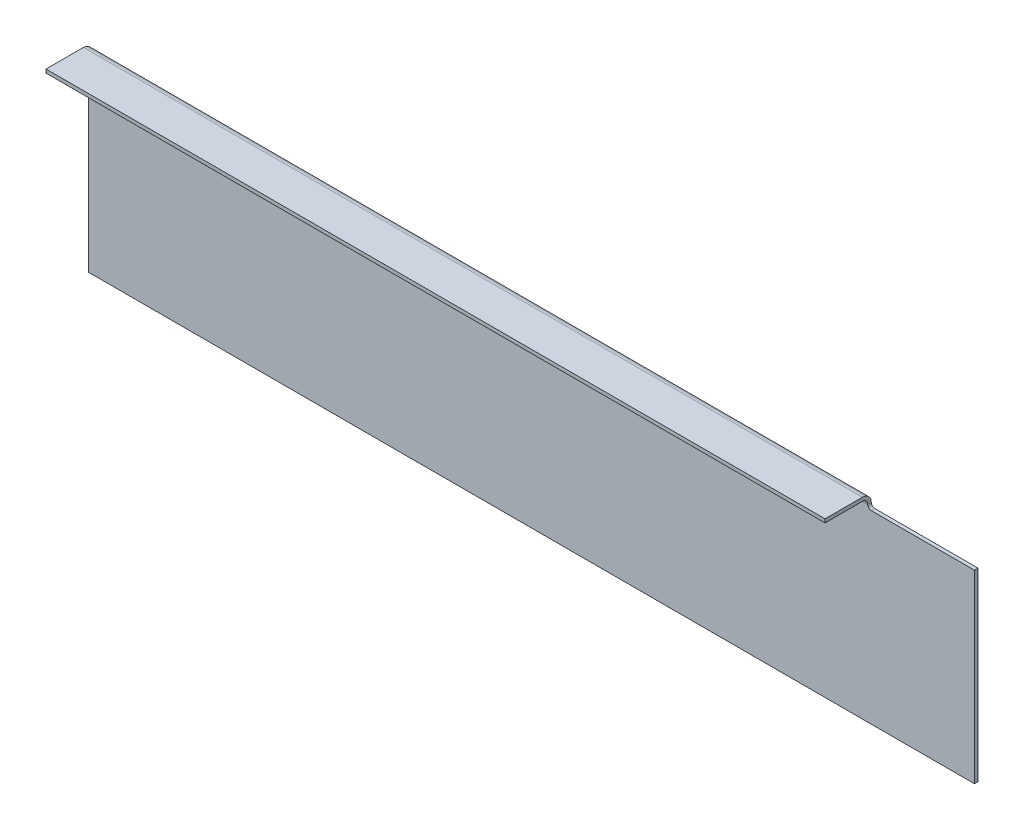
ISO-10303-21;
HEADER;
FILE_DESCRIPTION(('STEP AP214'),'2;1');
FILE_NAME('part.step','',(''),(''),'','','');
FILE_SCHEMA(('AUTOMOTIVE_DESIGN { 1 0 10303 214 1 1 1 1 }'));
ENDSEC;
DATA;
#1=APPLICATION_CONTEXT('core data for automotive mechanical design processes');
#2=APPLICATION_PROTOCOL_DEFINITION('international standard','automotive_design',2000,#1);
#3=PRODUCT_CONTEXT('',#1,'mechanical');
#4=PRODUCT('Part','Part','',(#3));
#5=PRODUCT_RELATED_PRODUCT_CATEGORY('part','',(#4));
#6=PRODUCT_DEFINITION_FORMATION('','',#4);
#7=PRODUCT_DEFINITION_CONTEXT('part definition',#1,'design');
#8=PRODUCT_DEFINITION('design','',#6,#7);
#9=PRODUCT_DEFINITION_SHAPE('','',#8);
#10=(LENGTH_UNIT() NAMED_UNIT(*) SI_UNIT(.MILLI.,.METRE.));
#11=(NAMED_UNIT(*) PLANE_ANGLE_UNIT() SI_UNIT($,.RADIAN.));
#12=(NAMED_UNIT(*) SI_UNIT($,.STERADIAN.) SOLID_ANGLE_UNIT());
#13=UNCERTAINTY_MEASURE_WITH_UNIT(LENGTH_MEASURE(1.E-05),#10,'distance_accuracy_value','');
#14=(GEOMETRIC_REPRESENTATION_CONTEXT(3) GLOBAL_UNCERTAINTY_ASSIGNED_CONTEXT((#13)) GLOBAL_UNIT_ASSIGNED_CONTEXT((#10,
#11,#12)) REPRESENTATION_CONTEXT('',''));
#15=CARTESIAN_POINT('',(0.,0.,0.));
#16=DIRECTION('',(0.,0.,1.));
#17=DIRECTION('',(1.,0.,0.));
#18=AXIS2_PLACEMENT_3D('',#15,#16,#17);
#19=CARTESIAN_POINT('',(78.999999999954,59.999999999954,-144.));
#20=DIRECTION('',(0.,0.,1.));
#21=DIRECTION('',(4.591527158693E-11,-1.,0.));
#22=AXIS2_PLACEMENT_3D('',#19,#20,#21);
#23=CYLINDRICAL_SURFACE('',#22,0.999999999954);
#24=DIRECTION('',(0.,0.,-1.));
#25=VECTOR('',#24,1.);
#26=CARTESIAN_POINT('',(79.,59.,-144.));
#27=LINE('',#26,#25);
#28=CARTESIAN_POINT('',(79.,59.,-144.));
#29=VERTEX_POINT('',#28);
#30=CARTESIAN_POINT('',(79.,59.,-145.));
#31=VERTEX_POINT('',#30);
#32=EDGE_CURVE('E26',#29,#31,#27,.T.);
#33=ORIENTED_EDGE('',*,*,#32,.T.);
#34=CARTESIAN_POINT('',(78.999999999954,59.999999999954,-145.));
#35=DIRECTION('',(0.,0.,-1.));
#36=DIRECTION('',(4.591527158693E-11,-1.,0.));
#37=AXIS2_PLACEMENT_3D('',#34,#35,#36);
#38=CIRCLE('',#37,0.999999999954);
#39=CARTESIAN_POINT('',(78.,60.,-145.));
#40=VERTEX_POINT('',#39);
#41=EDGE_CURVE('E11',#31,#40,#38,.T.);
#42=ORIENTED_EDGE('',*,*,#41,.T.);
#43=DIRECTION('',(0.,0.,-1.));
#44=VECTOR('',#43,1.);
#45=CARTESIAN_POINT('',(78.,60.,-144.));
#46=LINE('',#45,#44);
#47=CARTESIAN_POINT('',(78.,60.,-144.));
#48=VERTEX_POINT('',#47);
#49=EDGE_CURVE('E217',#48,#40,#46,.T.);
#50=ORIENTED_EDGE('',*,*,#49,.F.);
#51=CARTESIAN_POINT('',(78.999999999954,59.999999999954,-144.));
#52=DIRECTION('',(0.,0.,-1.));
#53=DIRECTION('',(4.591527158693E-11,-1.,0.));
#54=AXIS2_PLACEMENT_3D('',#51,#52,#53);
#55=CIRCLE('',#54,0.999999999954);
#56=EDGE_CURVE('E191',#29,#48,#55,.T.);
#57=ORIENTED_EDGE('',*,*,#56,.F.);
#58=EDGE_LOOP('',(#33,#42,#50,#57));
#59=FACE_BOUND('',#58,.T.);
#60=ADVANCED_FACE('F17',(#59),#23,.F.);
#61=CARTESIAN_POINT('',(108.,59.,-144.));
#62=DIRECTION('',(0.,1.,0.));
#63=DIRECTION('',(1.,0.,0.));
#64=AXIS2_PLACEMENT_3D('',#61,#62,#63);
#65=PLANE('',#64);
#66=DIRECTION('',(0.,0.,-1.));
#67=VECTOR('',#66,1.);
#68=CARTESIAN_POINT('',(108.,59.,-144.));
#69=LINE('',#68,#67);
#70=CARTESIAN_POINT('',(108.,59.,-144.));
#71=VERTEX_POINT('',#70);
#72=CARTESIAN_POINT('',(108.,59.,-145.));
#73=VERTEX_POINT('',#72);
#74=EDGE_CURVE('E222',#71,#73,#69,.T.);
#75=ORIENTED_EDGE('',*,*,#74,.T.);
#76=DIRECTION('',(-1.,0.,0.));
#77=VECTOR('',#76,1.);
#78=CARTESIAN_POINT('',(108.,59.,-145.));
#79=LINE('',#78,#77);
#80=EDGE_CURVE('E43',#73,#31,#79,.T.);
#81=ORIENTED_EDGE('',*,*,#80,.T.);
#82=ORIENTED_EDGE('',*,*,#32,.F.);
#83=DIRECTION('',(-1.,0.,0.));
#84=VECTOR('',#83,1.);
#85=CARTESIAN_POINT('',(108.,59.,-144.));
#86=LINE('',#85,#84);
#87=EDGE_CURVE('E187',#71,#29,#86,.T.);
#88=ORIENTED_EDGE('',*,*,#87,.F.);
#89=EDGE_LOOP('',(#75,#81,#82,#88));
#90=FACE_BOUND('',#89,.T.);
#91=ADVANCED_FACE('F241',(#90),#65,.T.);
#92=CARTESIAN_POINT('',(108.,7.,-144.));
#93=DIRECTION('',(1.,0.,0.));
#94=DIRECTION('',(0.,1.,0.));
#95=AXIS2_PLACEMENT_3D('',#92,#93,#94);
#96=PLANE('',#95);
#97=DIRECTION('',(0.,0.,-1.));
#98=VECTOR('',#97,1.);
#99=CARTESIAN_POINT('',(108.,7.,-144.));
#100=LINE('',#99,#98);
#101=CARTESIAN_POINT('',(108.,7.,-144.));
#102=VERTEX_POINT('',#101);
#103=CARTESIAN_POINT('',(108.,7.,-145.));
#104=VERTEX_POINT('',#103);
#105=EDGE_CURVE('E147',#102,#104,#100,.T.);
#106=ORIENTED_EDGE('',*,*,#105,.T.);
#107=DIRECTION('',(0.,1.,0.));
#108=VECTOR('',#107,1.);
#109=CARTESIAN_POINT('',(108.,7.,-145.));
#110=LINE('',#109,#108);
#111=EDGE_CURVE('E218',#104,#73,#110,.T.);
#112=ORIENTED_EDGE('',*,*,#111,.T.);
#113=ORIENTED_EDGE('',*,*,#74,.F.);
#114=DIRECTION('',(0.,1.,0.));
#115=VECTOR('',#114,1.);
#116=CARTESIAN_POINT('',(108.,7.,-144.));
#117=LINE('',#116,#115);
#118=EDGE_CURVE('E184',#102,#71,#117,.T.);
#119=ORIENTED_EDGE('',*,*,#118,.F.);
#120=EDGE_LOOP('',(#106,#112,#113,#119));
#121=FACE_BOUND('',#120,.T.);
#122=ADVANCED_FACE('F19',(#121),#96,.T.);
#123=CARTESIAN_POINT('',(-141.,60.,-142.5));
#124=DIRECTION('',(-1.,0.,0.));
#125=DIRECTION('',(0.,1.,0.));
#126=AXIS2_PLACEMENT_3D('',#123,#124,#125);
#127=CYLINDRICAL_SURFACE('',#126,2.5);
#128=DIRECTION('',(1.,0.,0.));
#129=VECTOR('',#128,1.);
#130=CARTESIAN_POINT('',(-141.,62.5,-142.5));
#131=LINE('',#130,#129);
#132=CARTESIAN_POINT('',(-141.,62.5,-142.5));
#133=VERTEX_POINT('',#132);
#134=CARTESIAN_POINT('',(78.,62.5,-142.5));
#135=VERTEX_POINT('',#134);
#136=EDGE_CURVE('E223',#133,#135,#131,.T.);
#137=ORIENTED_EDGE('',*,*,#136,.T.);
#138=CARTESIAN_POINT('',(78.,60.,-142.5));
#139=DIRECTION('',(-1.,0.,0.));
#140=DIRECTION('',(0.,1.,0.));
#141=AXIS2_PLACEMENT_3D('',#138,#139,#140);
#142=CIRCLE('',#141,2.5);
#143=EDGE_CURVE('E205',#135,#40,#142,.T.);
#144=ORIENTED_EDGE('',*,*,#143,.T.);
#145=DIRECTION('',(1.,0.,0.));
#146=VECTOR('',#145,1.);
#147=CARTESIAN_POINT('',(-141.,60.,-145.));
#148=LINE('',#147,#146);
#149=CARTESIAN_POINT('',(-141.,60.,-145.));
#150=VERTEX_POINT('',#149);
#151=EDGE_CURVE('E194',#150,#40,#148,.T.);
#152=ORIENTED_EDGE('',*,*,#151,.F.);
#153=CARTESIAN_POINT('',(-141.,60.,-142.5));
#154=DIRECTION('',(-1.,0.,0.));
#155=DIRECTION('',(0.,1.,0.));
#156=AXIS2_PLACEMENT_3D('',#153,#154,#155);
#157=CIRCLE('',#156,2.5);
#158=EDGE_CURVE('E157',#133,#150,#157,.T.);
#159=ORIENTED_EDGE('',*,*,#158,.F.);
#160=EDGE_LOOP('',(#137,#144,#152,#159));
#161=FACE_BOUND('',#160,.T.);
#162=ADVANCED_FACE('F414',(#161),#127,.T.);
#163=CARTESIAN_POINT('',(-141.,62.5,-132.));
#164=DIRECTION('',(0.,1.,0.));
#165=DIRECTION('',(1.,0.,0.));
#166=AXIS2_PLACEMENT_3D('',#163,#164,#165);
#167=PLANE('',#166);
#168=DIRECTION('',(1.,0.,0.));
#169=VECTOR('',#168,1.);
#170=CARTESIAN_POINT('',(-141.,62.5,-132.));
#171=LINE('',#170,#169);
#172=CARTESIAN_POINT('',(-141.,62.5,-132.));
#173=VERTEX_POINT('',#172);
#174=CARTESIAN_POINT('',(78.,62.5,-132.));
#175=VERTEX_POINT('',#174);
#176=EDGE_CURVE('E227',#173,#175,#171,.T.);
#177=ORIENTED_EDGE('',*,*,#176,.T.);
#178=DIRECTION('',(0.,0.,-1.));
#179=VECTOR('',#178,1.);
#180=CARTESIAN_POINT('',(78.,62.5,-132.));
#181=LINE('',#180,#179);
#182=EDGE_CURVE('E209',#175,#135,#181,.T.);
#183=ORIENTED_EDGE('',*,*,#182,.T.);
#184=ORIENTED_EDGE('',*,*,#136,.F.);
#185=DIRECTION('',(0.,0.,-1.));
#186=VECTOR('',#185,1.);
#187=CARTESIAN_POINT('',(-141.,62.5,-132.));
#188=LINE('',#187,#186);
#189=EDGE_CURVE('E178',#173,#133,#188,.T.);
#190=ORIENTED_EDGE('',*,*,#189,.F.);
#191=EDGE_LOOP('',(#177,#183,#184,#190));
#192=FACE_BOUND('',#191,.T.);
#193=ADVANCED_FACE('F409',(#192),#167,.T.);
#194=CARTESIAN_POINT('',(-141.,61.5,-132.));
#195=DIRECTION('',(0.,0.,1.));
#196=DIRECTION('',(1.,0.,0.));
#197=AXIS2_PLACEMENT_3D('',#194,#195,#196);
#198=PLANE('',#197);
#199=DIRECTION('',(1.,0.,0.));
#200=VECTOR('',#199,1.);
#201=CARTESIAN_POINT('',(-141.,61.5,-132.));
#202=LINE('',#201,#200);
#203=CARTESIAN_POINT('',(-141.,61.5,-132.));
#204=VERTEX_POINT('',#203);
#205=CARTESIAN_POINT('',(78.,61.5,-132.));
#206=VERTEX_POINT('',#205);
#207=EDGE_CURVE('E201',#204,#206,#202,.T.);
#208=ORIENTED_EDGE('',*,*,#207,.T.);
#209=DIRECTION('',(0.,1.,0.));
#210=VECTOR('',#209,1.);
#211=CARTESIAN_POINT('',(78.,61.5,-132.));
#212=LINE('',#211,#210);
#213=EDGE_CURVE('E213',#206,#175,#212,.T.);
#214=ORIENTED_EDGE('',*,*,#213,.T.);
#215=ORIENTED_EDGE('',*,*,#176,.F.);
#216=DIRECTION('',(0.,1.,0.));
#217=VECTOR('',#216,1.);
#218=CARTESIAN_POINT('',(-141.,61.5,-132.));
#219=LINE('',#218,#217);
#220=EDGE_CURVE('E174',#204,#173,#219,.T.);
#221=ORIENTED_EDGE('',*,*,#220,.F.);
#222=EDGE_LOOP('',(#208,#214,#215,#221));
#223=FACE_BOUND('',#222,.T.);
#224=ADVANCED_FACE('F413',(#223),#198,.T.);
#225=CARTESIAN_POINT('',(78.,39.219324050123,-143.2503818214));
#226=DIRECTION('',(-1.,0.,0.));
#227=DIRECTION('',(0.,0.,1.));
#228=AXIS2_PLACEMENT_3D('',#225,#226,#227);
#229=PLANE('',#228);
#230=ORIENTED_EDGE('',*,*,#143,.F.);
#231=ORIENTED_EDGE('',*,*,#182,.F.);
#232=ORIENTED_EDGE('',*,*,#213,.F.);
#233=DIRECTION('',(0.,0.,1.));
#234=VECTOR('',#233,1.);
#235=CARTESIAN_POINT('',(78.,61.5,-142.5));
#236=LINE('',#235,#234);
#237=CARTESIAN_POINT('',(78.,61.5,-142.5));
#238=VERTEX_POINT('',#237);
#239=EDGE_CURVE('E197',#238,#206,#236,.T.);
#240=ORIENTED_EDGE('',*,*,#239,.F.);
#241=CARTESIAN_POINT('',(78.,60.,-142.5));
#242=DIRECTION('',(1.,0.,0.));
#243=DIRECTION('',(0.,0.,-1.));
#244=AXIS2_PLACEMENT_3D('',#241,#242,#243);
#245=CIRCLE('',#244,1.5);
#246=EDGE_CURVE('E132',#48,#238,#245,.T.);
#247=ORIENTED_EDGE('',*,*,#246,.F.);
#248=ORIENTED_EDGE('',*,*,#49,.T.);
#249=EDGE_LOOP('',(#230,#231,#232,#240,#247,#248));
#250=FACE_BOUND('',#249,.T.);
#251=ADVANCED_FACE('F407',(#250),#229,.F.);
#252=CARTESIAN_POINT('',(-141.,61.5,-142.5));
#253=DIRECTION('',(0.,-1.,0.));
#254=DIRECTION('',(0.,0.,-1.));
#255=AXIS2_PLACEMENT_3D('',#252,#253,#254);
#256=PLANE('',#255);
#257=DIRECTION('',(1.,0.,0.));
#258=VECTOR('',#257,1.);
#259=CARTESIAN_POINT('',(-141.,61.5,-142.5));
#260=LINE('',#259,#258);
#261=CARTESIAN_POINT('',(-141.,61.5,-142.5));
#262=VERTEX_POINT('',#261);
#263=EDGE_CURVE('E160',#262,#238,#260,.T.);
#264=ORIENTED_EDGE('',*,*,#263,.T.);
#265=ORIENTED_EDGE('',*,*,#239,.T.);
#266=ORIENTED_EDGE('',*,*,#207,.F.);
#267=DIRECTION('',(0.,0.,1.));
#268=VECTOR('',#267,1.);
#269=CARTESIAN_POINT('',(-141.,61.5,-142.5));
#270=LINE('',#269,#268);
#271=EDGE_CURVE('E170',#262,#204,#270,.T.);
#272=ORIENTED_EDGE('',*,*,#271,.F.);
#273=EDGE_LOOP('',(#264,#265,#266,#272));
#274=FACE_BOUND('',#273,.T.);
#275=ADVANCED_FACE('F309',(#274),#256,.T.);
#276=CARTESIAN_POINT('',(-141.,60.,-145.));
#277=DIRECTION('',(0.,0.,-1.));
#278=DIRECTION('',(0.,-1.,0.));
#279=AXIS2_PLACEMENT_3D('',#276,#277,#278);
#280=PLANE('',#279);
#281=ORIENTED_EDGE('',*,*,#151,.T.);
#282=ORIENTED_EDGE('',*,*,#41,.F.);
#283=ORIENTED_EDGE('',*,*,#80,.F.);
#284=ORIENTED_EDGE('',*,*,#111,.F.);
#285=DIRECTION('',(1.,0.,0.));
#286=VECTOR('',#285,1.);
#287=CARTESIAN_POINT('',(-141.,7.,-145.));
#288=LINE('',#287,#286);
#289=CARTESIAN_POINT('',(-141.,7.,-145.));
#290=VERTEX_POINT('',#289);
#291=EDGE_CURVE('E133',#290,#104,#288,.T.);
#292=ORIENTED_EDGE('',*,*,#291,.F.);
#293=DIRECTION('',(0.,-1.,0.));
#294=VECTOR('',#293,1.);
#295=CARTESIAN_POINT('',(-141.,60.,-145.));
#296=LINE('',#295,#294);
#297=EDGE_CURVE('E127',#150,#290,#296,.T.);
#298=ORIENTED_EDGE('',*,*,#297,.F.);
#299=EDGE_LOOP('',(#281,#282,#283,#284,#292,#298));
#300=FACE_BOUND('',#299,.T.);
#301=ADVANCED_FACE('F243',(#300),#280,.T.);
#302=CARTESIAN_POINT('',(-141.,39.219324050123,-143.2503818214));
#303=DIRECTION('',(-1.,0.,0.));
#304=DIRECTION('',(0.,0.,1.));
#305=AXIS2_PLACEMENT_3D('',#302,#303,#304);
#306=PLANE('',#305);
#307=DIRECTION('',(0.,1.,0.));
#308=VECTOR('',#307,1.);
#309=CARTESIAN_POINT('',(-141.,7.,-144.));
#310=LINE('',#309,#308);
#311=CARTESIAN_POINT('',(-141.,7.,-144.));
#312=VERTEX_POINT('',#311);
#313=CARTESIAN_POINT('',(-141.,60.,-144.));
#314=VERTEX_POINT('',#313);
#315=EDGE_CURVE('E123',#312,#314,#310,.T.);
#316=ORIENTED_EDGE('',*,*,#315,.T.);
#317=CARTESIAN_POINT('',(-141.,60.,-142.5));
#318=DIRECTION('',(1.,0.,0.));
#319=DIRECTION('',(0.,0.,-1.));
#320=AXIS2_PLACEMENT_3D('',#317,#318,#319);
#321=CIRCLE('',#320,1.5);
#322=EDGE_CURVE('E164',#314,#262,#321,.T.);
#323=ORIENTED_EDGE('',*,*,#322,.T.);
#324=ORIENTED_EDGE('',*,*,#271,.T.);
#325=ORIENTED_EDGE('',*,*,#220,.T.);
#326=ORIENTED_EDGE('',*,*,#189,.T.);
#327=ORIENTED_EDGE('',*,*,#158,.T.);
#328=ORIENTED_EDGE('',*,*,#297,.T.);
#329=DIRECTION('',(0.,0.,1.));
#330=VECTOR('',#329,1.);
#331=CARTESIAN_POINT('',(-141.,7.,-145.));
#332=LINE('',#331,#330);
#333=EDGE_CURVE('E119',#290,#312,#332,.T.);
#334=ORIENTED_EDGE('',*,*,#333,.T.);
#335=EDGE_LOOP('',(#316,#323,#324,#325,#326,#327,#328,#334));
#336=FACE_BOUND('',#335,.T.);
#337=ADVANCED_FACE('F121',(#336),#306,.T.);
#338=CARTESIAN_POINT('',(-141.,60.,-142.5));
#339=DIRECTION('',(-1.,0.,0.));
#340=DIRECTION('',(0.,0.,-1.));
#341=AXIS2_PLACEMENT_3D('',#338,#339,#340);
#342=CYLINDRICAL_SURFACE('',#341,1.5);
#343=DIRECTION('',(1.,0.,0.));
#344=VECTOR('',#343,1.);
#345=CARTESIAN_POINT('',(-141.,60.,-144.));
#346=LINE('',#345,#344);
#347=EDGE_CURVE('E142',#314,#48,#346,.T.);
#348=ORIENTED_EDGE('',*,*,#347,.T.);
#349=ORIENTED_EDGE('',*,*,#246,.T.);
#350=ORIENTED_EDGE('',*,*,#263,.F.);
#351=ORIENTED_EDGE('',*,*,#322,.F.);
#352=EDGE_LOOP('',(#348,#349,#350,#351));
#353=FACE_BOUND('',#352,.T.);
#354=ADVANCED_FACE('F298',(#353),#342,.F.);
#355=CARTESIAN_POINT('',(-141.,7.,-145.));
#356=DIRECTION('',(0.,-1.,0.));
#357=DIRECTION('',(0.,0.,-1.));
#358=AXIS2_PLACEMENT_3D('',#355,#356,#357);
#359=PLANE('',#358);
#360=ORIENTED_EDGE('',*,*,#291,.T.);
#361=ORIENTED_EDGE('',*,*,#105,.F.);
#362=DIRECTION('',(1.,0.,0.));
#363=VECTOR('',#362,1.);
#364=CARTESIAN_POINT('',(-141.,7.,-144.));
#365=LINE('',#364,#363);
#366=EDGE_CURVE('E138',#312,#102,#365,.T.);
#367=ORIENTED_EDGE('',*,*,#366,.F.);
#368=ORIENTED_EDGE('',*,*,#333,.F.);
#369=EDGE_LOOP('',(#360,#361,#367,#368));
#370=FACE_BOUND('',#369,.T.);
#371=ADVANCED_FACE('F145',(#370),#359,.T.);
#372=CARTESIAN_POINT('',(-141.,7.,-144.));
#373=DIRECTION('',(0.,0.,1.));
#374=DIRECTION('',(1.,0.,0.));
#375=AXIS2_PLACEMENT_3D('',#372,#373,#374);
#376=PLANE('',#375);
#377=ORIENTED_EDGE('',*,*,#366,.T.);
#378=ORIENTED_EDGE('',*,*,#118,.T.);
#379=ORIENTED_EDGE('',*,*,#87,.T.);
#380=ORIENTED_EDGE('',*,*,#56,.T.);
#381=ORIENTED_EDGE('',*,*,#347,.F.);
#382=ORIENTED_EDGE('',*,*,#315,.F.);
#383=EDGE_LOOP('',(#377,#378,#379,#380,#381,#382));
#384=FACE_BOUND('',#383,.T.);
#385=ADVANCED_FACE('F136',(#384),#376,.T.);
#386=CLOSED_SHELL('',(#60,#91,#122,#162,#193,#224,#251,#275,#301,#337,#354,#371,#385));
#387=MANIFOLD_SOLID_BREP('B1',#386);
#388=ADVANCED_BREP_SHAPE_REPRESENTATION('',(#18,#387),#14);
#389=SHAPE_DEFINITION_REPRESENTATION(#9,#388);
ENDSEC;
END-ISO-10303-21;
